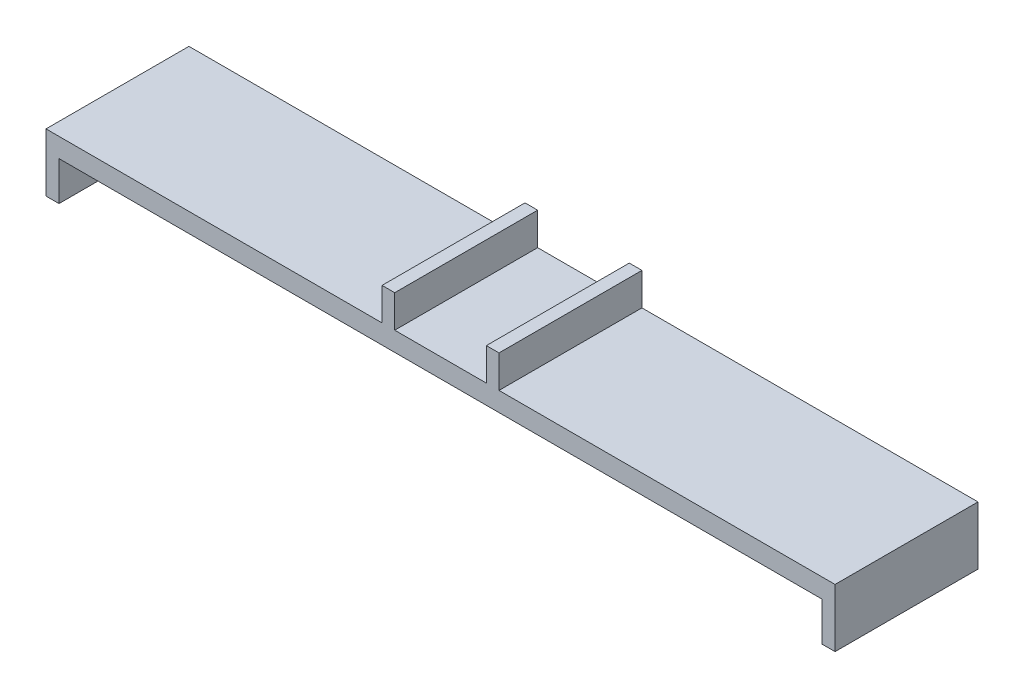
ISO-10303-21;
HEADER;
FILE_DESCRIPTION(('STEP AP214'),'2;1');
FILE_NAME('part.step','',(''),(''),'','','');
FILE_SCHEMA(('AUTOMOTIVE_DESIGN { 1 0 10303 214 1 1 1 1 }'));
ENDSEC;
DATA;
#1=APPLICATION_CONTEXT('core data for automotive mechanical design processes');
#2=APPLICATION_PROTOCOL_DEFINITION('international standard','automotive_design',2000,#1);
#3=PRODUCT_CONTEXT('',#1,'mechanical');
#4=PRODUCT('Part','Part','',(#3));
#5=PRODUCT_RELATED_PRODUCT_CATEGORY('part','',(#4));
#6=PRODUCT_DEFINITION_FORMATION('','',#4);
#7=PRODUCT_DEFINITION_CONTEXT('part definition',#1,'design');
#8=PRODUCT_DEFINITION('design','',#6,#7);
#9=PRODUCT_DEFINITION_SHAPE('','',#8);
#10=(LENGTH_UNIT() NAMED_UNIT(*) SI_UNIT(.MILLI.,.METRE.));
#11=(NAMED_UNIT(*) PLANE_ANGLE_UNIT() SI_UNIT($,.RADIAN.));
#12=(NAMED_UNIT(*) SI_UNIT($,.STERADIAN.) SOLID_ANGLE_UNIT());
#13=UNCERTAINTY_MEASURE_WITH_UNIT(LENGTH_MEASURE(1.E-05),#10,'distance_accuracy_value','');
#14=(GEOMETRIC_REPRESENTATION_CONTEXT(3) GLOBAL_UNCERTAINTY_ASSIGNED_CONTEXT((#13)) GLOBAL_UNIT_ASSIGNED_CONTEXT((#10,
#11,#12)) REPRESENTATION_CONTEXT('',''));
#15=CARTESIAN_POINT('',(0.,0.,0.));
#16=DIRECTION('',(0.,0.,1.));
#17=DIRECTION('',(1.,0.,0.));
#18=AXIS2_PLACEMENT_3D('',#15,#16,#17);
#19=CARTESIAN_POINT('',(0.,44.7999999999999,110.));
#20=DIRECTION('',(0.,-1.,0.));
#21=DIRECTION('',(0.,0.,-1.));
#22=AXIS2_PLACEMENT_3D('',#19,#20,#21);
#23=PLANE('',#22);
#24=DIRECTION('',(0.,0.,1.));
#25=VECTOR('',#24,1.);
#26=CARTESIAN_POINT('',(338.855665687464,44.7999999999999,110.));
#27=LINE('',#26,#25);
#28=CARTESIAN_POINT('',(338.855665687464,44.7999999999999,0.));
#29=VERTEX_POINT('',#28);
#30=CARTESIAN_POINT('',(338.855665687464,44.7999999999999,110.));
#31=VERTEX_POINT('',#30);
#32=EDGE_CURVE('E180',#29,#31,#27,.T.);
#33=ORIENTED_EDGE('',*,*,#32,.F.);
#34=DIRECTION('',(-1.,0.,0.));
#35=VECTOR('',#34,1.);
#36=CARTESIAN_POINT('',(0.,44.7999999999999,0.));
#37=LINE('',#36,#35);
#38=CARTESIAN_POINT('',(268.344334312536,44.7999999999999,0.));
#39=VERTEX_POINT('',#38);
#40=EDGE_CURVE('E239',#29,#39,#37,.T.);
#41=ORIENTED_EDGE('',*,*,#40,.T.);
#42=DIRECTION('',(0.,0.,-1.));
#43=VECTOR('',#42,1.);
#44=CARTESIAN_POINT('',(268.344334312536,44.7999999999999,110.));
#45=LINE('',#44,#43);
#46=CARTESIAN_POINT('',(268.344334312536,44.7999999999999,110.));
#47=VERTEX_POINT('',#46);
#48=EDGE_CURVE('E183',#47,#39,#45,.T.);
#49=ORIENTED_EDGE('',*,*,#48,.F.);
#50=DIRECTION('',(-1.,0.,0.));
#51=VECTOR('',#50,1.);
#52=CARTESIAN_POINT('',(0.,44.7999999999999,110.));
#53=LINE('',#52,#51);
#54=EDGE_CURVE('E66',#31,#47,#53,.T.);
#55=ORIENTED_EDGE('',*,*,#54,.F.);
#56=EDGE_LOOP('',(#33,#41,#49,#55));
#57=FACE_BOUND('',#56,.T.);
#58=ADVANCED_FACE('F43',(#57),#23,.F.);
#59=DIRECTION('',(0.,0.,-1.));
#60=VECTOR('',#59,1.);
#61=CARTESIAN_POINT('',(348.6,44.7999999999999,110.));
#62=LINE('',#61,#60);
#63=CARTESIAN_POINT('',(348.6,44.7999999999999,110.));
#64=VERTEX_POINT('',#63);
#65=CARTESIAN_POINT('',(348.6,44.7999999999999,0.));
#66=VERTEX_POINT('',#65);
#67=EDGE_CURVE('E206',#64,#66,#62,.T.);
#68=ORIENTED_EDGE('',*,*,#67,.F.);
#69=CARTESIAN_POINT('',(607.2,44.7999999999999,110.));
#70=VERTEX_POINT('',#69);
#71=EDGE_CURVE('E216',#70,#64,#53,.T.);
#72=ORIENTED_EDGE('',*,*,#71,.F.);
#73=DIRECTION('',(0.,0.,-1.));
#74=VECTOR('',#73,1.);
#75=CARTESIAN_POINT('',(607.2,44.7999999999999,110.));
#76=LINE('',#75,#74);
#77=CARTESIAN_POINT('',(607.2,44.7999999999999,0.));
#78=VERTEX_POINT('',#77);
#79=EDGE_CURVE('E11',#70,#78,#76,.T.);
#80=ORIENTED_EDGE('',*,*,#79,.T.);
#81=EDGE_CURVE('E236',#78,#66,#37,.T.);
#82=ORIENTED_EDGE('',*,*,#81,.T.);
#83=EDGE_LOOP('',(#68,#72,#80,#82));
#84=FACE_BOUND('',#83,.T.);
#85=ADVANCED_FACE('F338',(#84),#23,.F.);
#86=DIRECTION('',(0.,0.,1.));
#87=VECTOR('',#86,1.);
#88=CARTESIAN_POINT('',(258.6,44.7999999999999,110.));
#89=LINE('',#88,#87);
#90=CARTESIAN_POINT('',(258.6,44.7999999999999,0.));
#91=VERTEX_POINT('',#90);
#92=CARTESIAN_POINT('',(258.6,44.7999999999999,110.));
#93=VERTEX_POINT('',#92);
#94=EDGE_CURVE('E181',#91,#93,#89,.T.);
#95=ORIENTED_EDGE('',*,*,#94,.F.);
#96=CARTESIAN_POINT('',(0.,44.7999999999999,0.));
#97=VERTEX_POINT('',#96);
#98=EDGE_CURVE('E235',#91,#97,#37,.T.);
#99=ORIENTED_EDGE('',*,*,#98,.T.);
#100=DIRECTION('',(0.,0.,-1.));
#101=VECTOR('',#100,1.);
#102=CARTESIAN_POINT('',(0.,44.7999999999999,110.));
#103=LINE('',#102,#101);
#104=CARTESIAN_POINT('',(0.,44.7999999999999,110.));
#105=VERTEX_POINT('',#104);
#106=EDGE_CURVE('E51',#105,#97,#103,.T.);
#107=ORIENTED_EDGE('',*,*,#106,.F.);
#108=EDGE_CURVE('E214',#93,#105,#53,.T.);
#109=ORIENTED_EDGE('',*,*,#108,.F.);
#110=EDGE_LOOP('',(#95,#99,#107,#109));
#111=FACE_BOUND('',#110,.T.);
#112=ADVANCED_FACE('F304',(#111),#23,.F.);
#113=CARTESIAN_POINT('',(607.2,0.,110.));
#114=DIRECTION('',(1.,0.,0.));
#115=DIRECTION('',(0.,0.,-1.));
#116=AXIS2_PLACEMENT_3D('',#113,#114,#115);
#117=PLANE('',#116);
#118=DIRECTION('',(0.,-1.,0.));
#119=VECTOR('',#118,1.);
#120=CARTESIAN_POINT('',(607.2,0.,0.));
#121=LINE('',#120,#119);
#122=CARTESIAN_POINT('',(607.2,0.,0.));
#123=VERTEX_POINT('',#122);
#124=EDGE_CURVE('E210',#78,#123,#121,.T.);
#125=ORIENTED_EDGE('',*,*,#124,.F.);
#126=ORIENTED_EDGE('',*,*,#79,.F.);
#127=DIRECTION('',(0.,-1.,0.));
#128=VECTOR('',#127,1.);
#129=CARTESIAN_POINT('',(607.2,0.,110.));
#130=LINE('',#129,#128);
#131=CARTESIAN_POINT('',(607.2,0.,110.));
#132=VERTEX_POINT('',#131);
#133=EDGE_CURVE('E211',#70,#132,#130,.T.);
#134=ORIENTED_EDGE('',*,*,#133,.T.);
#135=DIRECTION('',(0.,0.,-1.));
#136=VECTOR('',#135,1.);
#137=CARTESIAN_POINT('',(607.2,0.,110.));
#138=LINE('',#137,#136);
#139=EDGE_CURVE('E232',#132,#123,#138,.T.);
#140=ORIENTED_EDGE('',*,*,#139,.T.);
#141=EDGE_LOOP('',(#125,#126,#134,#140));
#142=FACE_BOUND('',#141,.T.);
#143=ADVANCED_FACE('F45',(#142),#117,.T.);
#144=CARTESIAN_POINT('',(0.,0.,110.));
#145=DIRECTION('',(1.,0.,0.));
#146=DIRECTION('',(0.,1.,0.));
#147=AXIS2_PLACEMENT_3D('',#144,#145,#146);
#148=PLANE('',#147);
#149=DIRECTION('',(0.,-1.,0.));
#150=VECTOR('',#149,1.);
#151=CARTESIAN_POINT('',(0.,0.,0.));
#152=LINE('',#151,#150);
#153=CARTESIAN_POINT('',(0.,0.,0.));
#154=VERTEX_POINT('',#153);
#155=EDGE_CURVE('E238',#97,#154,#152,.T.);
#156=ORIENTED_EDGE('',*,*,#155,.T.);
#157=DIRECTION('',(0.,0.,-1.));
#158=VECTOR('',#157,1.);
#159=CARTESIAN_POINT('',(0.,0.,110.));
#160=LINE('',#159,#158);
#161=CARTESIAN_POINT('',(0.,0.,110.));
#162=VERTEX_POINT('',#161);
#163=EDGE_CURVE('E264',#162,#154,#160,.T.);
#164=ORIENTED_EDGE('',*,*,#163,.F.);
#165=DIRECTION('',(0.,-1.,0.));
#166=VECTOR('',#165,1.);
#167=CARTESIAN_POINT('',(0.,0.,110.));
#168=LINE('',#167,#166);
#169=EDGE_CURVE('E218',#105,#162,#168,.T.);
#170=ORIENTED_EDGE('',*,*,#169,.F.);
#171=ORIENTED_EDGE('',*,*,#106,.T.);
#172=EDGE_LOOP('',(#156,#164,#170,#171));
#173=FACE_BOUND('',#172,.T.);
#174=ADVANCED_FACE('F271',(#173),#148,.F.);
#175=CARTESIAN_POINT('',(0.,0.,110.));
#176=DIRECTION('',(0.,1.,0.));
#177=DIRECTION('',(0.,0.,1.));
#178=AXIS2_PLACEMENT_3D('',#175,#176,#177);
#179=PLANE('',#178);
#180=DIRECTION('',(1.,0.,0.));
#181=VECTOR('',#180,1.);
#182=CARTESIAN_POINT('',(0.,0.,0.));
#183=LINE('',#182,#181);
#184=CARTESIAN_POINT('',(10.,0.,0.));
#185=VERTEX_POINT('',#184);
#186=EDGE_CURVE('E241',#154,#185,#183,.T.);
#187=ORIENTED_EDGE('',*,*,#186,.T.);
#188=DIRECTION('',(0.,0.,-1.));
#189=VECTOR('',#188,1.);
#190=CARTESIAN_POINT('',(10.,0.,110.));
#191=LINE('',#190,#189);
#192=CARTESIAN_POINT('',(10.,0.,110.));
#193=VERTEX_POINT('',#192);
#194=EDGE_CURVE('E261',#193,#185,#191,.T.);
#195=ORIENTED_EDGE('',*,*,#194,.F.);
#196=DIRECTION('',(1.,0.,0.));
#197=VECTOR('',#196,1.);
#198=CARTESIAN_POINT('',(0.,0.,110.));
#199=LINE('',#198,#197);
#200=EDGE_CURVE('E220',#162,#193,#199,.T.);
#201=ORIENTED_EDGE('',*,*,#200,.F.);
#202=ORIENTED_EDGE('',*,*,#163,.T.);
#203=EDGE_LOOP('',(#187,#195,#201,#202));
#204=FACE_BOUND('',#203,.T.);
#205=ADVANCED_FACE('F284',(#204),#179,.F.);
#206=CARTESIAN_POINT('',(10.,0.,110.));
#207=DIRECTION('',(-1.,0.,0.));
#208=DIRECTION('',(0.,0.,1.));
#209=AXIS2_PLACEMENT_3D('',#206,#207,#208);
#210=PLANE('',#209);
#211=DIRECTION('',(0.,1.,0.));
#212=VECTOR('',#211,1.);
#213=CARTESIAN_POINT('',(10.,0.,0.));
#214=LINE('',#213,#212);
#215=CARTESIAN_POINT('',(10.,30.,0.));
#216=VERTEX_POINT('',#215);
#217=EDGE_CURVE('E243',#185,#216,#214,.T.);
#218=ORIENTED_EDGE('',*,*,#217,.T.);
#219=DIRECTION('',(0.,0.,-1.));
#220=VECTOR('',#219,1.);
#221=CARTESIAN_POINT('',(10.,30.,110.));
#222=LINE('',#221,#220);
#223=CARTESIAN_POINT('',(10.,30.,110.));
#224=VERTEX_POINT('',#223);
#225=EDGE_CURVE('E258',#224,#216,#222,.T.);
#226=ORIENTED_EDGE('',*,*,#225,.F.);
#227=DIRECTION('',(0.,1.,0.));
#228=VECTOR('',#227,1.);
#229=CARTESIAN_POINT('',(10.,0.,110.));
#230=LINE('',#229,#228);
#231=EDGE_CURVE('E222',#193,#224,#230,.T.);
#232=ORIENTED_EDGE('',*,*,#231,.F.);
#233=ORIENTED_EDGE('',*,*,#194,.T.);
#234=EDGE_LOOP('',(#218,#226,#232,#233));
#235=FACE_BOUND('',#234,.T.);
#236=ADVANCED_FACE('F288',(#235),#210,.F.);
#237=CARTESIAN_POINT('',(0.,30.,110.));
#238=DIRECTION('',(0.,1.,0.));
#239=DIRECTION('',(0.,0.,1.));
#240=AXIS2_PLACEMENT_3D('',#237,#238,#239);
#241=PLANE('',#240);
#242=DIRECTION('',(1.,0.,0.));
#243=VECTOR('',#242,1.);
#244=CARTESIAN_POINT('',(0.,30.,0.));
#245=LINE('',#244,#243);
#246=CARTESIAN_POINT('',(597.2,30.,0.));
#247=VERTEX_POINT('',#246);
#248=EDGE_CURVE('E245',#216,#247,#245,.T.);
#249=ORIENTED_EDGE('',*,*,#248,.T.);
#250=DIRECTION('',(0.,0.,-1.));
#251=VECTOR('',#250,1.);
#252=CARTESIAN_POINT('',(597.2,30.,110.));
#253=LINE('',#252,#251);
#254=CARTESIAN_POINT('',(597.2,30.,110.));
#255=VERTEX_POINT('',#254);
#256=EDGE_CURVE('E256',#255,#247,#253,.T.);
#257=ORIENTED_EDGE('',*,*,#256,.F.);
#258=DIRECTION('',(1.,0.,0.));
#259=VECTOR('',#258,1.);
#260=CARTESIAN_POINT('',(0.,30.,110.));
#261=LINE('',#260,#259);
#262=EDGE_CURVE('E224',#224,#255,#261,.T.);
#263=ORIENTED_EDGE('',*,*,#262,.F.);
#264=ORIENTED_EDGE('',*,*,#225,.T.);
#265=EDGE_LOOP('',(#249,#257,#263,#264));
#266=FACE_BOUND('',#265,.T.);
#267=ADVANCED_FACE('F328',(#266),#241,.F.);
#268=CARTESIAN_POINT('',(597.2,0.,110.));
#269=DIRECTION('',(-1.,0.,0.));
#270=DIRECTION('',(0.,0.,1.));
#271=AXIS2_PLACEMENT_3D('',#268,#269,#270);
#272=PLANE('',#271);
#273=DIRECTION('',(0.,1.,0.));
#274=VECTOR('',#273,1.);
#275=CARTESIAN_POINT('',(597.2,0.,0.));
#276=LINE('',#275,#274);
#277=CARTESIAN_POINT('',(597.2,0.,0.));
#278=VERTEX_POINT('',#277);
#279=EDGE_CURVE('E248',#278,#247,#276,.T.);
#280=ORIENTED_EDGE('',*,*,#279,.F.);
#281=DIRECTION('',(0.,0.,-1.));
#282=VECTOR('',#281,1.);
#283=CARTESIAN_POINT('',(597.2,0.,110.));
#284=LINE('',#283,#282);
#285=CARTESIAN_POINT('',(597.2,0.,110.));
#286=VERTEX_POINT('',#285);
#287=EDGE_CURVE('E254',#286,#278,#284,.T.);
#288=ORIENTED_EDGE('',*,*,#287,.F.);
#289=DIRECTION('',(0.,1.,0.));
#290=VECTOR('',#289,1.);
#291=CARTESIAN_POINT('',(597.2,0.,110.));
#292=LINE('',#291,#290);
#293=EDGE_CURVE('E226',#286,#255,#292,.T.);
#294=ORIENTED_EDGE('',*,*,#293,.T.);
#295=ORIENTED_EDGE('',*,*,#256,.T.);
#296=EDGE_LOOP('',(#280,#288,#294,#295));
#297=FACE_BOUND('',#296,.T.);
#298=ADVANCED_FACE('F326',(#297),#272,.T.);
#299=CARTESIAN_POINT('',(0.,0.,110.));
#300=DIRECTION('',(0.,-1.,0.));
#301=DIRECTION('',(0.,0.,-1.));
#302=AXIS2_PLACEMENT_3D('',#299,#300,#301);
#303=PLANE('',#302);
#304=DIRECTION('',(-1.,0.,0.));
#305=VECTOR('',#304,1.);
#306=CARTESIAN_POINT('',(0.,0.,0.));
#307=LINE('',#306,#305);
#308=EDGE_CURVE('E215',#123,#278,#307,.T.);
#309=ORIENTED_EDGE('',*,*,#308,.F.);
#310=ORIENTED_EDGE('',*,*,#139,.F.);
#311=DIRECTION('',(-1.,0.,0.));
#312=VECTOR('',#311,1.);
#313=CARTESIAN_POINT('',(0.,0.,110.));
#314=LINE('',#313,#312);
#315=EDGE_CURVE('E229',#132,#286,#314,.T.);
#316=ORIENTED_EDGE('',*,*,#315,.T.);
#317=ORIENTED_EDGE('',*,*,#287,.T.);
#318=EDGE_LOOP('',(#309,#310,#316,#317));
#319=FACE_BOUND('',#318,.T.);
#320=ADVANCED_FACE('F323',(#319),#303,.T.);
#321=CARTESIAN_POINT('',(0.,0.,110.));
#322=DIRECTION('',(0.,0.,1.));
#323=DIRECTION('',(1.,0.,0.));
#324=AXIS2_PLACEMENT_3D('',#321,#322,#323);
#325=PLANE('',#324);
#326=ORIENTED_EDGE('',*,*,#71,.T.);
#327=DIRECTION('',(0.,-1.,0.));
#328=VECTOR('',#327,1.);
#329=CARTESIAN_POINT('',(348.6,69.8,110.));
#330=LINE('',#329,#328);
#331=CARTESIAN_POINT('',(348.6,69.8,110.));
#332=VERTEX_POINT('',#331);
#333=EDGE_CURVE('E164',#332,#64,#330,.T.);
#334=ORIENTED_EDGE('',*,*,#333,.F.);
#335=DIRECTION('',(1.,0.,0.));
#336=VECTOR('',#335,1.);
#337=CARTESIAN_POINT('',(338.855665687464,69.8,110.));
#338=LINE('',#337,#336);
#339=CARTESIAN_POINT('',(338.855665687464,69.8,110.));
#340=VERTEX_POINT('',#339);
#341=EDGE_CURVE('E157',#340,#332,#338,.T.);
#342=ORIENTED_EDGE('',*,*,#341,.F.);
#343=DIRECTION('',(0.,-1.,0.));
#344=VECTOR('',#343,1.);
#345=CARTESIAN_POINT('',(338.855665687464,69.8,110.));
#346=LINE('',#345,#344);
#347=EDGE_CURVE('E162',#340,#31,#346,.T.);
#348=ORIENTED_EDGE('',*,*,#347,.T.);
#349=ORIENTED_EDGE('',*,*,#54,.T.);
#350=DIRECTION('',(0.,-1.,0.));
#351=VECTOR('',#350,1.);
#352=CARTESIAN_POINT('',(268.344334312536,69.8,110.));
#353=LINE('',#352,#351);
#354=CARTESIAN_POINT('',(268.344334312536,69.8,110.));
#355=VERTEX_POINT('',#354);
#356=EDGE_CURVE('E195',#355,#47,#353,.T.);
#357=ORIENTED_EDGE('',*,*,#356,.F.);
#358=DIRECTION('',(1.,0.,0.));
#359=VECTOR('',#358,1.);
#360=CARTESIAN_POINT('',(268.344334312536,69.8,110.));
#361=LINE('',#360,#359);
#362=CARTESIAN_POINT('',(258.6,69.8,110.));
#363=VERTEX_POINT('',#362);
#364=EDGE_CURVE('E197',#363,#355,#361,.T.);
#365=ORIENTED_EDGE('',*,*,#364,.F.);
#366=DIRECTION('',(0.,-1.,0.));
#367=VECTOR('',#366,1.);
#368=CARTESIAN_POINT('',(258.6,69.8,110.));
#369=LINE('',#368,#367);
#370=EDGE_CURVE('E58',#363,#93,#369,.T.);
#371=ORIENTED_EDGE('',*,*,#370,.T.);
#372=ORIENTED_EDGE('',*,*,#108,.T.);
#373=ORIENTED_EDGE('',*,*,#169,.T.);
#374=ORIENTED_EDGE('',*,*,#200,.T.);
#375=ORIENTED_EDGE('',*,*,#231,.T.);
#376=ORIENTED_EDGE('',*,*,#262,.T.);
#377=ORIENTED_EDGE('',*,*,#293,.F.);
#378=ORIENTED_EDGE('',*,*,#315,.F.);
#379=ORIENTED_EDGE('',*,*,#133,.F.);
#380=EDGE_LOOP('',(#326,#334,#342,#348,#349,#357,#365,#371,#372,#373,#374,#375,#376,#377,#378,#379));
#381=FACE_BOUND('',#380,.T.);
#382=ADVANCED_FACE('F160',(#381),#325,.T.);
#383=CARTESIAN_POINT('',(0.,0.,0.));
#384=DIRECTION('',(0.,0.,1.));
#385=DIRECTION('',(1.,0.,0.));
#386=AXIS2_PLACEMENT_3D('',#383,#384,#385);
#387=PLANE('',#386);
#388=ORIENTED_EDGE('',*,*,#40,.F.);
#389=DIRECTION('',(0.,-1.,0.));
#390=VECTOR('',#389,1.);
#391=CARTESIAN_POINT('',(338.855665687464,69.8,0.));
#392=LINE('',#391,#390);
#393=CARTESIAN_POINT('',(338.855665687464,69.8,0.));
#394=VERTEX_POINT('',#393);
#395=EDGE_CURVE('E306',#394,#29,#392,.T.);
#396=ORIENTED_EDGE('',*,*,#395,.F.);
#397=DIRECTION('',(-1.,0.,0.));
#398=VECTOR('',#397,1.);
#399=CARTESIAN_POINT('',(348.6,69.8,0.));
#400=LINE('',#399,#398);
#401=CARTESIAN_POINT('',(348.6,69.8,0.));
#402=VERTEX_POINT('',#401);
#403=EDGE_CURVE('E173',#402,#394,#400,.T.);
#404=ORIENTED_EDGE('',*,*,#403,.F.);
#405=DIRECTION('',(0.,-1.,0.));
#406=VECTOR('',#405,1.);
#407=CARTESIAN_POINT('',(348.6,69.8,0.));
#408=LINE('',#407,#406);
#409=EDGE_CURVE('E185',#402,#66,#408,.T.);
#410=ORIENTED_EDGE('',*,*,#409,.T.);
#411=ORIENTED_EDGE('',*,*,#81,.F.);
#412=ORIENTED_EDGE('',*,*,#124,.T.);
#413=ORIENTED_EDGE('',*,*,#308,.T.);
#414=ORIENTED_EDGE('',*,*,#279,.T.);
#415=ORIENTED_EDGE('',*,*,#248,.F.);
#416=ORIENTED_EDGE('',*,*,#217,.F.);
#417=ORIENTED_EDGE('',*,*,#186,.F.);
#418=ORIENTED_EDGE('',*,*,#155,.F.);
#419=ORIENTED_EDGE('',*,*,#98,.F.);
#420=DIRECTION('',(0.,-1.,0.));
#421=VECTOR('',#420,1.);
#422=CARTESIAN_POINT('',(258.6,69.8,0.));
#423=LINE('',#422,#421);
#424=CARTESIAN_POINT('',(258.6,69.8,0.));
#425=VERTEX_POINT('',#424);
#426=EDGE_CURVE('E192',#425,#91,#423,.T.);
#427=ORIENTED_EDGE('',*,*,#426,.F.);
#428=DIRECTION('',(-1.,0.,0.));
#429=VECTOR('',#428,1.);
#430=CARTESIAN_POINT('',(258.6,69.8,0.));
#431=LINE('',#430,#429);
#432=CARTESIAN_POINT('',(268.344334312536,69.8,0.));
#433=VERTEX_POINT('',#432);
#434=EDGE_CURVE('E201',#433,#425,#431,.T.);
#435=ORIENTED_EDGE('',*,*,#434,.F.);
#436=DIRECTION('',(0.,-1.,0.));
#437=VECTOR('',#436,1.);
#438=CARTESIAN_POINT('',(268.344334312536,69.8,0.));
#439=LINE('',#438,#437);
#440=EDGE_CURVE('E189',#433,#39,#439,.T.);
#441=ORIENTED_EDGE('',*,*,#440,.T.);
#442=EDGE_LOOP('',(#388,#396,#404,#410,#411,#412,#413,#414,#415,#416,#417,#418,#419,#427,#435,#441));
#443=FACE_BOUND('',#442,.T.);
#444=ADVANCED_FACE('F278',(#443),#387,.F.);
#445=CARTESIAN_POINT('',(268.344334312536,69.8,0.));
#446=DIRECTION('',(-1.,0.,0.));
#447=DIRECTION('',(0.,0.,1.));
#448=AXIS2_PLACEMENT_3D('',#445,#446,#447);
#449=PLANE('',#448);
#450=ORIENTED_EDGE('',*,*,#356,.T.);
#451=ORIENTED_EDGE('',*,*,#48,.T.);
#452=ORIENTED_EDGE('',*,*,#440,.F.);
#453=DIRECTION('',(0.,0.,-1.));
#454=VECTOR('',#453,1.);
#455=CARTESIAN_POINT('',(268.344334312536,69.8,0.));
#456=LINE('',#455,#454);
#457=EDGE_CURVE('E177',#355,#433,#456,.T.);
#458=ORIENTED_EDGE('',*,*,#457,.F.);
#459=EDGE_LOOP('',(#450,#451,#452,#458));
#460=FACE_BOUND('',#459,.T.);
#461=ADVANCED_FACE('F298',(#460),#449,.F.);
#462=CARTESIAN_POINT('',(258.6,69.8,110.));
#463=DIRECTION('',(1.,0.,0.));
#464=DIRECTION('',(0.,0.,-1.));
#465=AXIS2_PLACEMENT_3D('',#462,#463,#464);
#466=PLANE('',#465);
#467=ORIENTED_EDGE('',*,*,#426,.T.);
#468=ORIENTED_EDGE('',*,*,#94,.T.);
#469=ORIENTED_EDGE('',*,*,#370,.F.);
#470=DIRECTION('',(0.,0.,1.));
#471=VECTOR('',#470,1.);
#472=CARTESIAN_POINT('',(258.6,69.8,110.));
#473=LINE('',#472,#471);
#474=EDGE_CURVE('E199',#425,#363,#473,.T.);
#475=ORIENTED_EDGE('',*,*,#474,.F.);
#476=EDGE_LOOP('',(#467,#468,#469,#475));
#477=FACE_BOUND('',#476,.T.);
#478=ADVANCED_FACE('F303',(#477),#466,.F.);
#479=CARTESIAN_POINT('',(0.,69.8,0.));
#480=DIRECTION('',(0.,-1.,0.));
#481=DIRECTION('',(0.,0.,-1.));
#482=AXIS2_PLACEMENT_3D('',#479,#480,#481);
#483=PLANE('',#482);
#484=ORIENTED_EDGE('',*,*,#457,.T.);
#485=ORIENTED_EDGE('',*,*,#434,.T.);
#486=ORIENTED_EDGE('',*,*,#474,.T.);
#487=ORIENTED_EDGE('',*,*,#364,.T.);
#488=EDGE_LOOP('',(#484,#485,#486,#487));
#489=FACE_BOUND('',#488,.T.);
#490=ADVANCED_FACE('F300',(#489),#483,.F.);
#491=CARTESIAN_POINT('',(338.855665687464,69.8,0.));
#492=DIRECTION('',(1.,0.,0.));
#493=DIRECTION('',(0.,0.,-1.));
#494=AXIS2_PLACEMENT_3D('',#491,#492,#493);
#495=PLANE('',#494);
#496=ORIENTED_EDGE('',*,*,#395,.T.);
#497=ORIENTED_EDGE('',*,*,#32,.T.);
#498=ORIENTED_EDGE('',*,*,#347,.F.);
#499=DIRECTION('',(0.,0.,1.));
#500=VECTOR('',#499,1.);
#501=CARTESIAN_POINT('',(338.855665687464,69.8,0.));
#502=LINE('',#501,#500);
#503=EDGE_CURVE('E168',#394,#340,#502,.T.);
#504=ORIENTED_EDGE('',*,*,#503,.F.);
#505=EDGE_LOOP('',(#496,#497,#498,#504));
#506=FACE_BOUND('',#505,.T.);
#507=ADVANCED_FACE('F179',(#506),#495,.F.);
#508=CARTESIAN_POINT('',(348.6,69.8,110.));
#509=DIRECTION('',(-1.,0.,0.));
#510=DIRECTION('',(0.,0.,1.));
#511=AXIS2_PLACEMENT_3D('',#508,#509,#510);
#512=PLANE('',#511);
#513=ORIENTED_EDGE('',*,*,#333,.T.);
#514=ORIENTED_EDGE('',*,*,#67,.T.);
#515=ORIENTED_EDGE('',*,*,#409,.F.);
#516=DIRECTION('',(0.,0.,-1.));
#517=VECTOR('',#516,1.);
#518=CARTESIAN_POINT('',(348.6,69.8,110.));
#519=LINE('',#518,#517);
#520=EDGE_CURVE('E167',#332,#402,#519,.T.);
#521=ORIENTED_EDGE('',*,*,#520,.F.);
#522=EDGE_LOOP('',(#513,#514,#515,#521));
#523=FACE_BOUND('',#522,.T.);
#524=ADVANCED_FACE('F313',(#523),#512,.F.);
#525=CARTESIAN_POINT('',(0.,69.8,0.));
#526=DIRECTION('',(0.,1.,0.));
#527=DIRECTION('',(0.,0.,1.));
#528=AXIS2_PLACEMENT_3D('',#525,#526,#527);
#529=PLANE('',#528);
#530=ORIENTED_EDGE('',*,*,#503,.T.);
#531=ORIENTED_EDGE('',*,*,#341,.T.);
#532=ORIENTED_EDGE('',*,*,#520,.T.);
#533=ORIENTED_EDGE('',*,*,#403,.T.);
#534=EDGE_LOOP('',(#530,#531,#532,#533));
#535=FACE_BOUND('',#534,.T.);
#536=ADVANCED_FACE('F171',(#535),#529,.T.);
#537=CLOSED_SHELL('',(#58,#85,#112,#143,#174,#205,#236,#267,#298,#320,#382,#444,#461,#478,#490,
#507,#524,#536));
#538=MANIFOLD_SOLID_BREP('B2',#537);
#539=ADVANCED_BREP_SHAPE_REPRESENTATION('',(#18,#538),#14);
#540=SHAPE_DEFINITION_REPRESENTATION(#9,#539);
ENDSEC;
END-ISO-10303-21;
